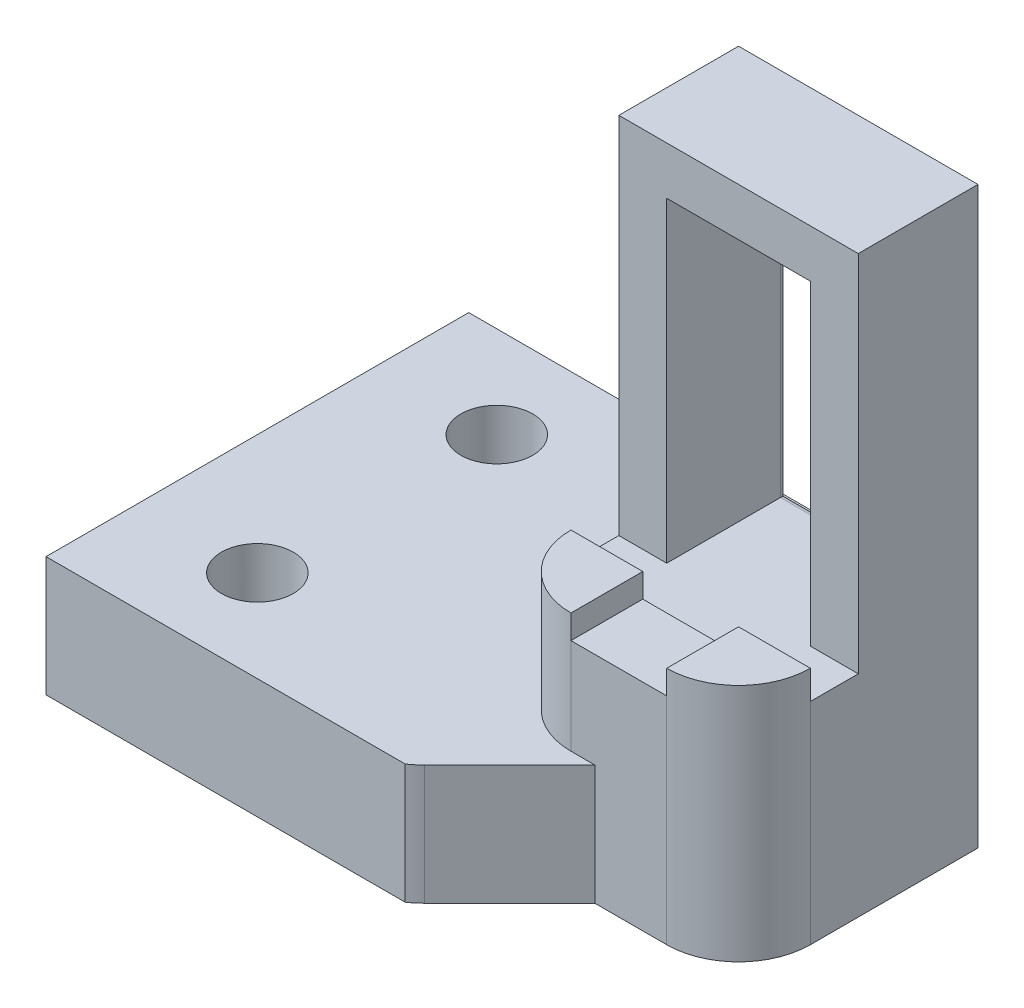
ISO-10303-21;
HEADER;
FILE_DESCRIPTION(('STEP AP214'),'2;1');
FILE_NAME('part.step','',(''),(''),'','','');
FILE_SCHEMA(('AUTOMOTIVE_DESIGN { 1 0 10303 214 1 1 1 1 }'));
ENDSEC;
DATA;
#1=APPLICATION_CONTEXT('core data for automotive mechanical design processes');
#2=APPLICATION_PROTOCOL_DEFINITION('international standard','automotive_design',2000,#1);
#3=PRODUCT_CONTEXT('',#1,'mechanical');
#4=PRODUCT('Part','Part','',(#3));
#5=PRODUCT_RELATED_PRODUCT_CATEGORY('part','',(#4));
#6=PRODUCT_DEFINITION_FORMATION('','',#4);
#7=PRODUCT_DEFINITION_CONTEXT('part definition',#1,'design');
#8=PRODUCT_DEFINITION('design','',#6,#7);
#9=PRODUCT_DEFINITION_SHAPE('','',#8);
#10=(LENGTH_UNIT() NAMED_UNIT(*) SI_UNIT(.MILLI.,.METRE.));
#11=(NAMED_UNIT(*) PLANE_ANGLE_UNIT() SI_UNIT($,.RADIAN.));
#12=(NAMED_UNIT(*) SI_UNIT($,.STERADIAN.) SOLID_ANGLE_UNIT());
#13=UNCERTAINTY_MEASURE_WITH_UNIT(LENGTH_MEASURE(1.E-05),#10,'distance_accuracy_value','');
#14=(GEOMETRIC_REPRESENTATION_CONTEXT(3) GLOBAL_UNCERTAINTY_ASSIGNED_CONTEXT((#13)) GLOBAL_UNIT_ASSIGNED_CONTEXT((#10,
#11,#12)) REPRESENTATION_CONTEXT('',''));
#15=CARTESIAN_POINT('',(0.,0.,0.));
#16=DIRECTION('',(0.,0.,1.));
#17=DIRECTION('',(1.,0.,0.));
#18=AXIS2_PLACEMENT_3D('',#15,#16,#17);
#19=CARTESIAN_POINT('',(0.,0.,0.));
#20=DIRECTION('',(0.,1.,0.));
#21=DIRECTION('',(0.,0.,1.));
#22=AXIS2_PLACEMENT_3D('',#19,#20,#21);
#23=PLANE('',#22);
#24=CARTESIAN_POINT('',(-30.,0.,-9.90312920037835));
#25=DIRECTION('',(0.,1.,0.));
#26=DIRECTION('',(0.,0.,1.));
#27=AXIS2_PLACEMENT_3D('',#24,#25,#26);
#28=CIRCLE('',#27,1.5);
#29=CARTESIAN_POINT('',(-30.,0.,-8.40312920037835));
#30=VERTEX_POINT('',#29);
#31=EDGE_CURVE('E422',#30,#30,#28,.T.);
#32=ORIENTED_EDGE('',*,*,#31,.T.);
#33=EDGE_LOOP('',(#32));
#34=FACE_BOUND('',#33,.T.);
#35=CARTESIAN_POINT('',(-30.,0.,0.0968707996216508));
#36=DIRECTION('',(0.,1.,0.));
#37=DIRECTION('',(0.,0.,1.));
#38=AXIS2_PLACEMENT_3D('',#35,#36,#37);
#39=CIRCLE('',#38,1.5);
#40=CARTESIAN_POINT('',(-30.,0.,1.59687079962165));
#41=VERTEX_POINT('',#40);
#42=EDGE_CURVE('E426',#41,#41,#39,.T.);
#43=ORIENTED_EDGE('',*,*,#42,.T.);
#44=EDGE_LOOP('',(#43));
#45=FACE_BOUND('',#44,.T.);
#46=DIRECTION('',(1.,0.,0.));
#47=VECTOR('',#46,1.);
#48=CARTESIAN_POINT('',(-45.,0.,-13.7305391633734));
#49=LINE('',#48,#47);
#50=CARTESIAN_POINT('',(-35.,0.,-13.7305391633734));
#51=VERTEX_POINT('',#50);
#52=CARTESIAN_POINT('',(-20.,0.,-13.7305391633734));
#53=VERTEX_POINT('',#52);
#54=EDGE_CURVE('E247',#51,#53,#49,.T.);
#55=ORIENTED_EDGE('',*,*,#54,.T.);
#56=DIRECTION('',(0.,0.,1.));
#57=VECTOR('',#56,1.);
#58=CARTESIAN_POINT('',(-20.,0.,0.));
#59=LINE('',#58,#57);
#60=CARTESIAN_POINT('',(-20.,0.,-9.99999999999999));
#61=VERTEX_POINT('',#60);
#62=EDGE_CURVE('E213',#53,#61,#59,.T.);
#63=ORIENTED_EDGE('',*,*,#62,.T.);
#64=DIRECTION('',(-1.,0.,0.));
#65=VECTOR('',#64,1.);
#66=CARTESIAN_POINT('',(0.,0.,-10.));
#67=LINE('',#66,#65);
#68=CARTESIAN_POINT('',(-10.,0.,-10.));
#69=VERTEX_POINT('',#68);
#70=EDGE_CURVE('E210',#69,#61,#67,.T.);
#71=ORIENTED_EDGE('',*,*,#70,.F.);
#72=DIRECTION('',(0.,0.,1.));
#73=VECTOR('',#72,1.);
#74=CARTESIAN_POINT('',(-10.,0.,0.));
#75=LINE('',#74,#73);
#76=CARTESIAN_POINT('',(-10.,0.,-2.99999999999999));
#77=VERTEX_POINT('',#76);
#78=EDGE_CURVE('E253',#69,#77,#75,.T.);
#79=ORIENTED_EDGE('',*,*,#78,.T.);
#80=CARTESIAN_POINT('',(-13.,0.,-3.));
#81=DIRECTION('',(0.,1.,0.));
#82=DIRECTION('',(0.,0.,1.));
#83=AXIS2_PLACEMENT_3D('',#80,#81,#82);
#84=CIRCLE('',#83,3.);
#85=CARTESIAN_POINT('',(-13.,0.,0.));
#86=VERTEX_POINT('',#85);
#87=EDGE_CURVE('E395',#77,#86,#84,.F.);
#88=ORIENTED_EDGE('',*,*,#87,.T.);
#89=DIRECTION('',(1.,0.,0.));
#90=VECTOR('',#89,1.);
#91=CARTESIAN_POINT('',(-30.,0.,0.));
#92=LINE('',#91,#90);
#93=CARTESIAN_POINT('',(-16.,0.,0.));
#94=VERTEX_POINT('',#93);
#95=EDGE_CURVE('E336',#94,#86,#92,.T.);
#96=ORIENTED_EDGE('',*,*,#95,.F.);
#97=DIRECTION('',(0.707106781186543,0.,-0.707106781186552));
#98=VECTOR('',#97,1.);
#99=CARTESIAN_POINT('',(-8.00000000000011,0.,-8.00000000000001));
#100=LINE('',#99,#98);
#101=CARTESIAN_POINT('',(-19.5631524016239,0.,3.56315240162395));
#102=VERTEX_POINT('',#101);
#103=EDGE_CURVE('E379',#94,#102,#100,.F.);
#104=ORIENTED_EDGE('',*,*,#103,.T.);
#105=CARTESIAN_POINT('',(-21.6844727451836,0.,1.44183205806432));
#106=DIRECTION('',(0.,1.,0.));
#107=DIRECTION('',(0.,0.,1.));
#108=AXIS2_PLACEMENT_3D('',#105,#106,#107);
#109=CIRCLE('',#108,3.);
#110=CARTESIAN_POINT('',(-20.,0.,3.92428076261668));
#111=VERTEX_POINT('',#110);
#112=EDGE_CURVE('E392',#102,#111,#109,.F.);
#113=ORIENTED_EDGE('',*,*,#112,.T.);
#114=DIRECTION('',(1.,0.,0.));
#115=VECTOR('',#114,1.);
#116=CARTESIAN_POINT('',(-45.,0.,3.92428076261668));
#117=LINE('',#116,#115);
#118=CARTESIAN_POINT('',(-35.,0.,3.92428076261668));
#119=VERTEX_POINT('',#118);
#120=EDGE_CURVE('E245',#119,#111,#117,.T.);
#121=ORIENTED_EDGE('',*,*,#120,.F.);
#122=DIRECTION('',(0.,0.,1.));
#123=VECTOR('',#122,1.);
#124=CARTESIAN_POINT('',(-35.,0.,-13.7305391633734));
#125=LINE('',#124,#123);
#126=EDGE_CURVE('E52',#51,#119,#125,.T.);
#127=ORIENTED_EDGE('',*,*,#126,.F.);
#128=EDGE_LOOP('',(#55,#63,#71,#79,#88,#96,#104,#113,#121,#127));
#129=FACE_BOUND('',#128,.T.);
#130=ADVANCED_FACE('F37',(#34,#45,#129),#23,.F.);
#131=CARTESIAN_POINT('',(0.,5.,0.));
#132=DIRECTION('',(0.,1.,0.));
#133=DIRECTION('',(0.,0.,1.));
#134=AXIS2_PLACEMENT_3D('',#131,#132,#133);
#135=PLANE('',#134);
#136=DIRECTION('',(0.,0.,1.));
#137=VECTOR('',#136,1.);
#138=CARTESIAN_POINT('',(-20.,5.,-9.99999999999999));
#139=LINE('',#138,#137);
#140=CARTESIAN_POINT('',(-20.,5.,-13.7305391633734));
#141=VERTEX_POINT('',#140);
#142=CARTESIAN_POINT('',(-20.,5.,-9.99999999999999));
#143=VERTEX_POINT('',#142);
#144=EDGE_CURVE('E214',#141,#143,#139,.T.);
#145=ORIENTED_EDGE('',*,*,#144,.F.);
#146=DIRECTION('',(1.,0.,0.));
#147=VECTOR('',#146,1.);
#148=CARTESIAN_POINT('',(-45.,5.,-13.7305391633734));
#149=LINE('',#148,#147);
#150=CARTESIAN_POINT('',(-35.,5.,-13.7305391633734));
#151=VERTEX_POINT('',#150);
#152=EDGE_CURVE('E236',#151,#141,#149,.T.);
#153=ORIENTED_EDGE('',*,*,#152,.F.);
#154=DIRECTION('',(0.,0.,-1.));
#155=VECTOR('',#154,1.);
#156=CARTESIAN_POINT('',(-35.,5.,3.92428076261668));
#157=LINE('',#156,#155);
#158=CARTESIAN_POINT('',(-35.,5.,3.92428076261668));
#159=VERTEX_POINT('',#158);
#160=EDGE_CURVE('E421',#159,#151,#157,.T.);
#161=ORIENTED_EDGE('',*,*,#160,.F.);
#162=DIRECTION('',(1.,0.,0.));
#163=VECTOR('',#162,1.);
#164=CARTESIAN_POINT('',(-45.,5.,3.92428076261668));
#165=LINE('',#164,#163);
#166=CARTESIAN_POINT('',(-20.,5.,3.92428076261668));
#167=VERTEX_POINT('',#166);
#168=EDGE_CURVE('E239',#159,#167,#165,.T.);
#169=ORIENTED_EDGE('',*,*,#168,.T.);
#170=CARTESIAN_POINT('',(-21.6844727451836,5.,1.44183205806432));
#171=DIRECTION('',(0.,1.,0.));
#172=DIRECTION('',(0.,0.,1.));
#173=AXIS2_PLACEMENT_3D('',#170,#171,#172);
#174=CIRCLE('',#173,3.);
#175=CARTESIAN_POINT('',(-19.5631524016239,5.,3.56315240162395));
#176=VERTEX_POINT('',#175);
#177=EDGE_CURVE('E60',#167,#176,#174,.T.);
#178=ORIENTED_EDGE('',*,*,#177,.T.);
#179=DIRECTION('',(-0.707106781186543,0.,0.707106781186552));
#180=VECTOR('',#179,1.);
#181=CARTESIAN_POINT('',(-20.,5.,4.00000000000003));
#182=LINE('',#181,#180);
#183=CARTESIAN_POINT('',(-16.,5.,0.));
#184=VERTEX_POINT('',#183);
#185=EDGE_CURVE('E377',#176,#184,#182,.F.);
#186=ORIENTED_EDGE('',*,*,#185,.T.);
#187=DIRECTION('',(1.,0.,0.));
#188=VECTOR('',#187,1.);
#189=CARTESIAN_POINT('',(-30.,5.,0.));
#190=LINE('',#189,#188);
#191=CARTESIAN_POINT('',(-17.,5.,0.));
#192=VERTEX_POINT('',#191);
#193=EDGE_CURVE('E374',#192,#184,#190,.T.);
#194=ORIENTED_EDGE('',*,*,#193,.F.);
#195=CARTESIAN_POINT('',(-17.,5.,-2.99999999999999));
#196=DIRECTION('',(0.,1.,0.));
#197=DIRECTION('',(0.,0.,1.));
#198=AXIS2_PLACEMENT_3D('',#195,#196,#197);
#199=CIRCLE('',#198,3.);
#200=CARTESIAN_POINT('',(-20.,5.,-2.99999999999999));
#201=VERTEX_POINT('',#200);
#202=EDGE_CURVE('E45',#192,#201,#199,.F.);
#203=ORIENTED_EDGE('',*,*,#202,.T.);
#204=DIRECTION('',(0.,0.,-1.));
#205=VECTOR('',#204,1.);
#206=CARTESIAN_POINT('',(-20.,5.,-13.7305391633734));
#207=LINE('',#206,#205);
#208=EDGE_CURVE('E224',#201,#143,#207,.T.);
#209=ORIENTED_EDGE('',*,*,#208,.T.);
#210=EDGE_LOOP('',(#145,#153,#161,#169,#178,#186,#194,#203,#209));
#211=FACE_BOUND('',#210,.T.);
#212=CARTESIAN_POINT('',(-30.,5.,-9.90312920037835));
#213=DIRECTION('',(0.,1.,0.));
#214=DIRECTION('',(0.,0.,1.));
#215=AXIS2_PLACEMENT_3D('',#212,#213,#214);
#216=CIRCLE('',#215,1.5);
#217=CARTESIAN_POINT('',(-30.,5.,-8.40312920037835));
#218=VERTEX_POINT('',#217);
#219=EDGE_CURVE('E431',#218,#218,#216,.T.);
#220=ORIENTED_EDGE('',*,*,#219,.F.);
#221=EDGE_LOOP('',(#220));
#222=FACE_BOUND('',#221,.T.);
#223=CARTESIAN_POINT('',(-30.,5.,0.0968707996216508));
#224=DIRECTION('',(0.,1.,0.));
#225=DIRECTION('',(0.,0.,-1.));
#226=AXIS2_PLACEMENT_3D('',#223,#224,#225);
#227=CIRCLE('',#226,1.5);
#228=CARTESIAN_POINT('',(-30.,5.,-1.40312920037835));
#229=VERTEX_POINT('',#228);
#230=EDGE_CURVE('E432',#229,#229,#227,.T.);
#231=ORIENTED_EDGE('',*,*,#230,.F.);
#232=EDGE_LOOP('',(#231));
#233=FACE_BOUND('',#232,.T.);
#234=ADVANCED_FACE('F231',(#211,#222,#233),#135,.T.);
#235=CARTESIAN_POINT('',(-45.,5.,-13.7305391633734));
#236=DIRECTION('',(0.,0.,1.));
#237=DIRECTION('',(1.,0.,0.));
#238=AXIS2_PLACEMENT_3D('',#235,#236,#237);
#239=PLANE('',#238);
#240=DIRECTION('',(0.,-1.,0.));
#241=VECTOR('',#240,1.);
#242=CARTESIAN_POINT('',(-35.,5.,-13.7305391633734));
#243=LINE('',#242,#241);
#244=EDGE_CURVE('E416',#151,#51,#243,.T.);
#245=ORIENTED_EDGE('',*,*,#244,.F.);
#246=ORIENTED_EDGE('',*,*,#152,.T.);
#247=DIRECTION('',(0.,1.,0.));
#248=VECTOR('',#247,1.);
#249=CARTESIAN_POINT('',(-20.,-5.,-13.7305391633734));
#250=LINE('',#249,#248);
#251=EDGE_CURVE('E11',#141,#53,#250,.F.);
#252=ORIENTED_EDGE('',*,*,#251,.T.);
#253=ORIENTED_EDGE('',*,*,#54,.F.);
#254=EDGE_LOOP('',(#245,#246,#252,#253));
#255=FACE_BOUND('',#254,.T.);
#256=ADVANCED_FACE('F419',(#255),#239,.F.);
#257=CARTESIAN_POINT('',(-45.,5.,3.92428076261668));
#258=DIRECTION('',(0.,0.,-1.));
#259=DIRECTION('',(-1.,0.,0.));
#260=AXIS2_PLACEMENT_3D('',#257,#258,#259);
#261=PLANE('',#260);
#262=DIRECTION('',(0.,1.,0.));
#263=VECTOR('',#262,1.);
#264=CARTESIAN_POINT('',(-35.,0.,3.92428076261668));
#265=LINE('',#264,#263);
#266=EDGE_CURVE('E237',#119,#159,#265,.T.);
#267=ORIENTED_EDGE('',*,*,#266,.F.);
#268=ORIENTED_EDGE('',*,*,#120,.T.);
#269=DIRECTION('',(0.,1.,0.));
#270=VECTOR('',#269,1.);
#271=CARTESIAN_POINT('',(-20.,-5.,3.92428076261668));
#272=LINE('',#271,#270);
#273=EDGE_CURVE('E250',#111,#167,#272,.T.);
#274=ORIENTED_EDGE('',*,*,#273,.T.);
#275=ORIENTED_EDGE('',*,*,#168,.F.);
#276=EDGE_LOOP('',(#267,#268,#274,#275));
#277=FACE_BOUND('',#276,.T.);
#278=ADVANCED_FACE('F414',(#277),#261,.F.);
#279=CARTESIAN_POINT('',(-20.,4.,0.));
#280=DIRECTION('',(1.,0.,0.));
#281=DIRECTION('',(0.,0.,-1.));
#282=AXIS2_PLACEMENT_3D('',#279,#280,#281);
#283=PLANE('',#282);
#284=ORIENTED_EDGE('',*,*,#208,.F.);
#285=DIRECTION('',(0.,-1.,0.));
#286=VECTOR('',#285,1.);
#287=CARTESIAN_POINT('',(-20.,4.,-2.99999999999999));
#288=LINE('',#287,#286);
#289=CARTESIAN_POINT('',(-20.,8.8,-3.));
#290=VERTEX_POINT('',#289);
#291=EDGE_CURVE('E386',#201,#290,#288,.F.);
#292=ORIENTED_EDGE('',*,*,#291,.T.);
#293=DIRECTION('',(0.,0.,1.));
#294=VECTOR('',#293,1.);
#295=CARTESIAN_POINT('',(-20.,8.8,-5.));
#296=LINE('',#295,#294);
#297=CARTESIAN_POINT('',(-20.,8.8,-5.));
#298=VERTEX_POINT('',#297);
#299=EDGE_CURVE('E294',#298,#290,#296,.T.);
#300=ORIENTED_EDGE('',*,*,#299,.F.);
#301=DIRECTION('',(0.,1.,0.));
#302=VECTOR('',#301,1.);
#303=CARTESIAN_POINT('',(-20.,-7.18033988749895,-5.));
#304=LINE('',#303,#302);
#305=CARTESIAN_POINT('',(-20.,24.,-5.));
#306=VERTEX_POINT('',#305);
#307=EDGE_CURVE('E306',#298,#306,#304,.T.);
#308=ORIENTED_EDGE('',*,*,#307,.T.);
#309=DIRECTION('',(0.,0.,1.));
#310=VECTOR('',#309,1.);
#311=CARTESIAN_POINT('',(-20.,24.,5.00000000000001));
#312=LINE('',#311,#310);
#313=CARTESIAN_POINT('',(-20.,24.,-10.));
#314=VERTEX_POINT('',#313);
#315=EDGE_CURVE('E227',#314,#306,#312,.T.);
#316=ORIENTED_EDGE('',*,*,#315,.F.);
#317=DIRECTION('',(0.,-1.,0.));
#318=VECTOR('',#317,1.);
#319=CARTESIAN_POINT('',(-20.,24.,-10.));
#320=LINE('',#319,#318);
#321=EDGE_CURVE('E207',#314,#143,#320,.T.);
#322=ORIENTED_EDGE('',*,*,#321,.T.);
#323=EDGE_LOOP('',(#284,#292,#300,#308,#316,#322));
#324=FACE_BOUND('',#323,.T.);
#325=ADVANCED_FACE('F223',(#324),#283,.F.);
#326=CARTESIAN_POINT('',(-30.,4.,0.));
#327=DIRECTION('',(0.,0.,-1.));
#328=DIRECTION('',(-1.,0.,0.));
#329=AXIS2_PLACEMENT_3D('',#326,#327,#328);
#330=PLANE('',#329);
#331=DIRECTION('',(1.,0.,0.));
#332=VECTOR('',#331,1.);
#333=CARTESIAN_POINT('',(-17.,9.,0.));
#334=LINE('',#333,#332);
#335=CARTESIAN_POINT('',(-17.,9.,0.));
#336=VERTEX_POINT('',#335);
#337=CARTESIAN_POINT('',(-13.,9.,0.));
#338=VERTEX_POINT('',#337);
#339=EDGE_CURVE('E284',#336,#338,#334,.T.);
#340=ORIENTED_EDGE('',*,*,#339,.F.);
#341=DIRECTION('',(0.,-1.,0.));
#342=VECTOR('',#341,1.);
#343=CARTESIAN_POINT('',(-17.,4.,0.));
#344=LINE('',#343,#342);
#345=EDGE_CURVE('E384',#336,#192,#344,.T.);
#346=ORIENTED_EDGE('',*,*,#345,.T.);
#347=ORIENTED_EDGE('',*,*,#193,.T.);
#348=DIRECTION('',(0.,-1.,0.));
#349=VECTOR('',#348,1.);
#350=CARTESIAN_POINT('',(-16.,0.,0.));
#351=LINE('',#350,#349);
#352=EDGE_CURVE('E372',#184,#94,#351,.T.);
#353=ORIENTED_EDGE('',*,*,#352,.T.);
#354=ORIENTED_EDGE('',*,*,#95,.T.);
#355=DIRECTION('',(0.,-1.,0.));
#356=VECTOR('',#355,1.);
#357=CARTESIAN_POINT('',(-13.,4.,0.));
#358=LINE('',#357,#356);
#359=EDGE_CURVE('E382',#86,#338,#358,.F.);
#360=ORIENTED_EDGE('',*,*,#359,.T.);
#361=EDGE_LOOP('',(#340,#346,#347,#353,#354,#360));
#362=FACE_BOUND('',#361,.T.);
#363=ADVANCED_FACE('F450',(#362),#330,.F.);
#364=CARTESIAN_POINT('',(0.,4.,-10.));
#365=DIRECTION('',(0.,0.,1.));
#366=DIRECTION('',(1.,0.,0.));
#367=AXIS2_PLACEMENT_3D('',#364,#365,#366);
#368=PLANE('',#367);
#369=DIRECTION('',(0.,1.,0.));
#370=VECTOR('',#369,1.);
#371=CARTESIAN_POINT('',(-20.,-9.,-9.99999999999999));
#372=LINE('',#371,#370);
#373=EDGE_CURVE('E201',#61,#143,#372,.T.);
#374=ORIENTED_EDGE('',*,*,#373,.T.);
#375=ORIENTED_EDGE('',*,*,#321,.F.);
#376=DIRECTION('',(-1.,0.,0.));
#377=VECTOR('',#376,1.);
#378=CARTESIAN_POINT('',(-20.,24.,-10.));
#379=LINE('',#378,#377);
#380=CARTESIAN_POINT('',(-10.,24.,-10.));
#381=VERTEX_POINT('',#380);
#382=EDGE_CURVE('E229',#381,#314,#379,.T.);
#383=ORIENTED_EDGE('',*,*,#382,.F.);
#384=DIRECTION('',(0.,-1.,0.));
#385=VECTOR('',#384,1.);
#386=CARTESIAN_POINT('',(-10.,24.,-10.));
#387=LINE('',#386,#385);
#388=EDGE_CURVE('E228',#381,#69,#387,.T.);
#389=ORIENTED_EDGE('',*,*,#388,.T.);
#390=ORIENTED_EDGE('',*,*,#70,.T.);
#391=EDGE_LOOP('',(#374,#375,#383,#389,#390));
#392=FACE_BOUND('',#391,.T.);
#393=DIRECTION('',(1.,0.,0.));
#394=VECTOR('',#393,1.);
#395=CARTESIAN_POINT('',(0.,22.25,-10.));
#396=LINE('',#395,#394);
#397=CARTESIAN_POINT('',(-11.75,22.25,-10.));
#398=VERTEX_POINT('',#397);
#399=CARTESIAN_POINT('',(-18.25,22.25,-10.));
#400=VERTEX_POINT('',#399);
#401=EDGE_CURVE('E346',#398,#400,#396,.F.);
#402=ORIENTED_EDGE('',*,*,#401,.T.);
#403=DIRECTION('',(0.,1.,0.));
#404=VECTOR('',#403,1.);
#405=CARTESIAN_POINT('',(-18.25,4.,-10.));
#406=LINE('',#405,#404);
#407=CARTESIAN_POINT('',(-18.25,8.55,-10.));
#408=VERTEX_POINT('',#407);
#409=EDGE_CURVE('E351',#400,#408,#406,.F.);
#410=ORIENTED_EDGE('',*,*,#409,.T.);
#411=DIRECTION('',(-1.,0.,0.));
#412=VECTOR('',#411,1.);
#413=CARTESIAN_POINT('',(0.,8.55,-10.));
#414=LINE('',#413,#412);
#415=CARTESIAN_POINT('',(-11.75,8.55,-10.));
#416=VERTEX_POINT('',#415);
#417=EDGE_CURVE('E348',#408,#416,#414,.F.);
#418=ORIENTED_EDGE('',*,*,#417,.T.);
#419=DIRECTION('',(0.,-1.,0.));
#420=VECTOR('',#419,1.);
#421=CARTESIAN_POINT('',(-11.75,4.,-10.));
#422=LINE('',#421,#420);
#423=EDGE_CURVE('E344',#416,#398,#422,.F.);
#424=ORIENTED_EDGE('',*,*,#423,.T.);
#425=EDGE_LOOP('',(#402,#410,#418,#424));
#426=FACE_BOUND('',#425,.T.);
#427=ADVANCED_FACE('F203',(#392,#426),#368,.F.);
#428=CARTESIAN_POINT('',(-12.,8.8,-0.5));
#429=DIRECTION('',(0.,-1.,0.));
#430=DIRECTION('',(1.,0.,0.));
#431=AXIS2_PLACEMENT_3D('',#428,#429,#430);
#432=PLANE('',#431);
#433=DIRECTION('',(-1.,0.,0.));
#434=VECTOR('',#433,1.);
#435=CARTESIAN_POINT('',(-10.,8.8,-3.));
#436=LINE('',#435,#434);
#437=CARTESIAN_POINT('',(-10.,8.8,-3.));
#438=VERTEX_POINT('',#437);
#439=EDGE_CURVE('E271',#438,#290,#436,.T.);
#440=ORIENTED_EDGE('',*,*,#439,.F.);
#441=DIRECTION('',(0.,0.,-1.));
#442=VECTOR('',#441,1.);
#443=CARTESIAN_POINT('',(-10.,8.8,-5.));
#444=LINE('',#443,#442);
#445=CARTESIAN_POINT('',(-10.,8.8,-5.));
#446=VERTEX_POINT('',#445);
#447=EDGE_CURVE('E297',#438,#446,#444,.T.);
#448=ORIENTED_EDGE('',*,*,#447,.T.);
#449=DIRECTION('',(-1.,0.,0.));
#450=VECTOR('',#449,1.);
#451=CARTESIAN_POINT('',(-20.,8.8,-5.));
#452=LINE('',#451,#450);
#453=CARTESIAN_POINT('',(-12.,8.8,-5.));
#454=VERTEX_POINT('',#453);
#455=EDGE_CURVE('E300',#446,#454,#452,.T.);
#456=ORIENTED_EDGE('',*,*,#455,.T.);
#457=DIRECTION('',(0.,0.,-1.));
#458=VECTOR('',#457,1.);
#459=CARTESIAN_POINT('',(-12.,8.8,-0.5));
#460=LINE('',#459,#458);
#461=CARTESIAN_POINT('',(-12.,8.8,-9.75));
#462=VERTEX_POINT('',#461);
#463=EDGE_CURVE('E318',#454,#462,#460,.T.);
#464=ORIENTED_EDGE('',*,*,#463,.T.);
#465=DIRECTION('',(-1.,0.,0.));
#466=VECTOR('',#465,1.);
#467=CARTESIAN_POINT('',(-12.,8.8,-9.75));
#468=LINE('',#467,#466);
#469=CARTESIAN_POINT('',(-18.,8.8,-9.75));
#470=VERTEX_POINT('',#469);
#471=EDGE_CURVE('E341',#462,#470,#468,.T.);
#472=ORIENTED_EDGE('',*,*,#471,.T.);
#473=DIRECTION('',(0.,0.,-1.));
#474=VECTOR('',#473,1.);
#475=CARTESIAN_POINT('',(-18.,8.8,-0.5));
#476=LINE('',#475,#474);
#477=CARTESIAN_POINT('',(-18.,8.8,-5.));
#478=VERTEX_POINT('',#477);
#479=EDGE_CURVE('E325',#478,#470,#476,.T.);
#480=ORIENTED_EDGE('',*,*,#479,.F.);
#481=DIRECTION('',(1.,0.,0.));
#482=VECTOR('',#481,1.);
#483=CARTESIAN_POINT('',(-20.,8.8,-5.));
#484=LINE('',#483,#482);
#485=EDGE_CURVE('E339',#298,#478,#484,.T.);
#486=ORIENTED_EDGE('',*,*,#485,.F.);
#487=ORIENTED_EDGE('',*,*,#299,.T.);
#488=EDGE_LOOP('',(#440,#448,#456,#464,#472,#480,#486,#487));
#489=FACE_BOUND('',#488,.T.);
#490=ADVANCED_FACE('F469',(#489),#432,.F.);
#491=CARTESIAN_POINT('',(0.,10.,0.));
#492=DIRECTION('',(0.,1.,0.));
#493=DIRECTION('',(0.,0.,1.));
#494=AXIS2_PLACEMENT_3D('',#491,#492,#493);
#495=PLANE('',#494);
#496=DIRECTION('',(0.,0.,-1.));
#497=VECTOR('',#496,1.);
#498=CARTESIAN_POINT('',(-13.,10.,0.));
#499=LINE('',#498,#497);
#500=CARTESIAN_POINT('',(-13.,10.,0.));
#501=VERTEX_POINT('',#500);
#502=CARTESIAN_POINT('',(-13.,10.,-3.));
#503=VERTEX_POINT('',#502);
#504=EDGE_CURVE('E370',#501,#503,#499,.T.);
#505=ORIENTED_EDGE('',*,*,#504,.F.);
#506=CARTESIAN_POINT('',(-13.,10.,-3.));
#507=DIRECTION('',(0.,1.,0.));
#508=DIRECTION('',(0.,0.,1.));
#509=AXIS2_PLACEMENT_3D('',#506,#507,#508);
#510=CIRCLE('',#509,3.);
#511=CARTESIAN_POINT('',(-10.,10.,-3.));
#512=VERTEX_POINT('',#511);
#513=EDGE_CURVE('E397',#501,#512,#510,.T.);
#514=ORIENTED_EDGE('',*,*,#513,.T.);
#515=DIRECTION('',(1.,0.,0.));
#516=VECTOR('',#515,1.);
#517=CARTESIAN_POINT('',(-13.,10.,-3.));
#518=LINE('',#517,#516);
#519=EDGE_CURVE('E265',#503,#512,#518,.T.);
#520=ORIENTED_EDGE('',*,*,#519,.F.);
#521=EDGE_LOOP('',(#505,#514,#520));
#522=FACE_BOUND('',#521,.T.);
#523=ADVANCED_FACE('F477',(#522),#495,.T.);
#524=CARTESIAN_POINT('',(-10.,4.,5.00000000000001));
#525=DIRECTION('',(-1.,0.,0.));
#526=DIRECTION('',(0.,0.,1.));
#527=AXIS2_PLACEMENT_3D('',#524,#525,#526);
#528=PLANE('',#527);
#529=ORIENTED_EDGE('',*,*,#447,.F.);
#530=DIRECTION('',(0.,-1.,0.));
#531=VECTOR('',#530,1.);
#532=CARTESIAN_POINT('',(-10.,4.,-2.99999999999999));
#533=LINE('',#532,#531);
#534=EDGE_CURVE('E390',#438,#77,#533,.T.);
#535=ORIENTED_EDGE('',*,*,#534,.T.);
#536=ORIENTED_EDGE('',*,*,#78,.F.);
#537=ORIENTED_EDGE('',*,*,#388,.F.);
#538=DIRECTION('',(0.,0.,-1.));
#539=VECTOR('',#538,1.);
#540=CARTESIAN_POINT('',(-10.,24.,5.00000000000001));
#541=LINE('',#540,#539);
#542=CARTESIAN_POINT('',(-10.,24.,-5.));
#543=VERTEX_POINT('',#542);
#544=EDGE_CURVE('E331',#543,#381,#541,.T.);
#545=ORIENTED_EDGE('',*,*,#544,.F.);
#546=DIRECTION('',(0.,1.,0.));
#547=VECTOR('',#546,1.);
#548=CARTESIAN_POINT('',(-10.,-7.18033988749895,-5.));
#549=LINE('',#548,#547);
#550=EDGE_CURVE('E305',#446,#543,#549,.T.);
#551=ORIENTED_EDGE('',*,*,#550,.F.);
#552=EDGE_LOOP('',(#529,#535,#536,#537,#545,#551));
#553=FACE_BOUND('',#552,.T.);
#554=ADVANCED_FACE('F496',(#553),#528,.F.);
#555=CARTESIAN_POINT('',(0.,24.,0.));
#556=DIRECTION('',(0.,-1.,0.));
#557=DIRECTION('',(0.,0.,-1.));
#558=AXIS2_PLACEMENT_3D('',#555,#556,#557);
#559=PLANE('',#558);
#560=ORIENTED_EDGE('',*,*,#315,.T.);
#561=DIRECTION('',(-1.,0.,0.));
#562=VECTOR('',#561,1.);
#563=CARTESIAN_POINT('',(-20.,24.,-5.));
#564=LINE('',#563,#562);
#565=EDGE_CURVE('E302',#543,#306,#564,.T.);
#566=ORIENTED_EDGE('',*,*,#565,.F.);
#567=ORIENTED_EDGE('',*,*,#544,.T.);
#568=ORIENTED_EDGE('',*,*,#382,.T.);
#569=EDGE_LOOP('',(#560,#566,#567,#568));
#570=FACE_BOUND('',#569,.T.);
#571=ADVANCED_FACE('F508',(#570),#559,.F.);
#572=CARTESIAN_POINT('',(-12.,22.,-0.5));
#573=DIRECTION('',(1.,0.,0.));
#574=DIRECTION('',(0.,1.,0.));
#575=AXIS2_PLACEMENT_3D('',#572,#573,#574);
#576=PLANE('',#575);
#577=DIRECTION('',(0.,0.,-1.));
#578=VECTOR('',#577,1.);
#579=CARTESIAN_POINT('',(-12.,22.,-0.5));
#580=LINE('',#579,#578);
#581=CARTESIAN_POINT('',(-12.,22.,-5.));
#582=VERTEX_POINT('',#581);
#583=CARTESIAN_POINT('',(-12.,22.,-9.75));
#584=VERTEX_POINT('',#583);
#585=EDGE_CURVE('E319',#582,#584,#580,.T.);
#586=ORIENTED_EDGE('',*,*,#585,.T.);
#587=DIRECTION('',(0.,-1.,0.));
#588=VECTOR('',#587,1.);
#589=CARTESIAN_POINT('',(-12.,22.,-9.75));
#590=LINE('',#589,#588);
#591=EDGE_CURVE('E357',#584,#462,#590,.T.);
#592=ORIENTED_EDGE('',*,*,#591,.T.);
#593=ORIENTED_EDGE('',*,*,#463,.F.);
#594=DIRECTION('',(0.,1.,0.));
#595=VECTOR('',#594,1.);
#596=CARTESIAN_POINT('',(-12.,22.,-5.));
#597=LINE('',#596,#595);
#598=EDGE_CURVE('E315',#454,#582,#597,.T.);
#599=ORIENTED_EDGE('',*,*,#598,.T.);
#600=EDGE_LOOP('',(#586,#592,#593,#599));
#601=FACE_BOUND('',#600,.T.);
#602=ADVANCED_FACE('F842',(#601),#576,.F.);
#603=CARTESIAN_POINT('',(-12.,22.,-0.5));
#604=DIRECTION('',(0.,1.,0.));
#605=DIRECTION('',(0.,0.,1.));
#606=AXIS2_PLACEMENT_3D('',#603,#604,#605);
#607=PLANE('',#606);
#608=DIRECTION('',(0.,0.,-1.));
#609=VECTOR('',#608,1.);
#610=CARTESIAN_POINT('',(-18.,22.,-0.5));
#611=LINE('',#610,#609);
#612=CARTESIAN_POINT('',(-18.,22.,-5.));
#613=VERTEX_POINT('',#612);
#614=CARTESIAN_POINT('',(-18.,22.,-9.75));
#615=VERTEX_POINT('',#614);
#616=EDGE_CURVE('E322',#613,#615,#611,.T.);
#617=ORIENTED_EDGE('',*,*,#616,.T.);
#618=DIRECTION('',(1.,0.,0.));
#619=VECTOR('',#618,1.);
#620=CARTESIAN_POINT('',(-12.,22.,-9.75));
#621=LINE('',#620,#619);
#622=EDGE_CURVE('E353',#615,#584,#621,.T.);
#623=ORIENTED_EDGE('',*,*,#622,.T.);
#624=ORIENTED_EDGE('',*,*,#585,.F.);
#625=DIRECTION('',(-1.,0.,0.));
#626=VECTOR('',#625,1.);
#627=CARTESIAN_POINT('',(-12.,22.,-5.));
#628=LINE('',#627,#626);
#629=EDGE_CURVE('E312',#582,#613,#628,.T.);
#630=ORIENTED_EDGE('',*,*,#629,.T.);
#631=EDGE_LOOP('',(#617,#623,#624,#630));
#632=FACE_BOUND('',#631,.T.);
#633=ADVANCED_FACE('F833',(#632),#607,.F.);
#634=CARTESIAN_POINT('',(-18.,22.,-0.5));
#635=DIRECTION('',(-1.,0.,0.));
#636=DIRECTION('',(0.,0.,1.));
#637=AXIS2_PLACEMENT_3D('',#634,#635,#636);
#638=PLANE('',#637);
#639=ORIENTED_EDGE('',*,*,#479,.T.);
#640=DIRECTION('',(0.,1.,0.));
#641=VECTOR('',#640,1.);
#642=CARTESIAN_POINT('',(-18.,22.,-9.75));
#643=LINE('',#642,#641);
#644=EDGE_CURVE('E355',#470,#615,#643,.T.);
#645=ORIENTED_EDGE('',*,*,#644,.T.);
#646=ORIENTED_EDGE('',*,*,#616,.F.);
#647=DIRECTION('',(0.,-1.,0.));
#648=VECTOR('',#647,1.);
#649=CARTESIAN_POINT('',(-18.,22.,-5.));
#650=LINE('',#649,#648);
#651=EDGE_CURVE('E308',#613,#478,#650,.T.);
#652=ORIENTED_EDGE('',*,*,#651,.T.);
#653=EDGE_LOOP('',(#639,#645,#646,#652));
#654=FACE_BOUND('',#653,.T.);
#655=ADVANCED_FACE('F491',(#654),#638,.F.);
#656=CARTESIAN_POINT('',(-20.,-7.18033988749895,-5.));
#657=DIRECTION('',(0.,0.,-1.));
#658=DIRECTION('',(-1.,0.,0.));
#659=AXIS2_PLACEMENT_3D('',#656,#657,#658);
#660=PLANE('',#659);
#661=ORIENTED_EDGE('',*,*,#307,.F.);
#662=ORIENTED_EDGE('',*,*,#485,.T.);
#663=ORIENTED_EDGE('',*,*,#651,.F.);
#664=ORIENTED_EDGE('',*,*,#629,.F.);
#665=ORIENTED_EDGE('',*,*,#598,.F.);
#666=ORIENTED_EDGE('',*,*,#455,.F.);
#667=ORIENTED_EDGE('',*,*,#550,.T.);
#668=ORIENTED_EDGE('',*,*,#565,.T.);
#669=EDGE_LOOP('',(#661,#662,#663,#664,#665,#666,#667,#668));
#670=FACE_BOUND('',#669,.T.);
#671=ADVANCED_FACE('F482',(#670),#660,.F.);
#672=DIRECTION('',(1.,0.,0.));
#673=VECTOR('',#672,1.);
#674=CARTESIAN_POINT('',(-20.,10.,-3.));
#675=LINE('',#674,#673);
#676=CARTESIAN_POINT('',(-20.,10.,-3.));
#677=VERTEX_POINT('',#676);
#678=CARTESIAN_POINT('',(-17.,10.,-3.));
#679=VERTEX_POINT('',#678);
#680=EDGE_CURVE('E276',#677,#679,#675,.T.);
#681=ORIENTED_EDGE('',*,*,#680,.F.);
#682=CARTESIAN_POINT('',(-17.,10.,-2.99999999999999));
#683=DIRECTION('',(0.,1.,0.));
#684=DIRECTION('',(0.,0.,1.));
#685=AXIS2_PLACEMENT_3D('',#682,#683,#684);
#686=CIRCLE('',#685,3.);
#687=CARTESIAN_POINT('',(-17.,10.,0.));
#688=VERTEX_POINT('',#687);
#689=EDGE_CURVE('E388',#677,#688,#686,.T.);
#690=ORIENTED_EDGE('',*,*,#689,.T.);
#691=DIRECTION('',(0.,0.,1.));
#692=VECTOR('',#691,1.);
#693=CARTESIAN_POINT('',(-17.,10.,0.));
#694=LINE('',#693,#692);
#695=EDGE_CURVE('E359',#679,#688,#694,.T.);
#696=ORIENTED_EDGE('',*,*,#695,.F.);
#697=EDGE_LOOP('',(#681,#690,#696));
#698=FACE_BOUND('',#697,.T.);
#699=ADVANCED_FACE('F479',(#698),#495,.T.);
#700=CARTESIAN_POINT('',(-12.,22.25,-9.75));
#701=DIRECTION('',(1.,0.,0.));
#702=DIRECTION('',(0.,0.,-1.));
#703=AXIS2_PLACEMENT_3D('',#700,#701,#702);
#704=CYLINDRICAL_SURFACE('',#703,0.25);
#705=CARTESIAN_POINT('',(-18.25,22.25,-9.75));
#706=DIRECTION('',(0.707106781186547,0.707106781186547,0.));
#707=DIRECTION('',(0.707106781186547,-0.707106781186547,0.));
#708=AXIS2_PLACEMENT_3D('',#705,#706,#707);
#709=ELLIPSE('',#708,0.353553390593274,0.25);
#710=EDGE_CURVE('E363',#400,#615,#709,.F.);
#711=ORIENTED_EDGE('',*,*,#710,.F.);
#712=ORIENTED_EDGE('',*,*,#401,.F.);
#713=CARTESIAN_POINT('',(-11.75,22.25,-9.75));
#714=DIRECTION('',(0.707106781186547,-0.707106781186548,0.));
#715=DIRECTION('',(0.707106781186548,0.707106781186547,0.));
#716=AXIS2_PLACEMENT_3D('',#713,#714,#715);
#717=ELLIPSE('',#716,0.353553390593274,0.25);
#718=EDGE_CURVE('E298',#584,#398,#717,.T.);
#719=ORIENTED_EDGE('',*,*,#718,.F.);
#720=ORIENTED_EDGE('',*,*,#622,.F.);
#721=EDGE_LOOP('',(#711,#712,#719,#720));
#722=FACE_BOUND('',#721,.T.);
#723=ADVANCED_FACE('F481',(#722),#704,.T.);
#724=CARTESIAN_POINT('',(-11.75,22.,-9.75));
#725=DIRECTION('',(0.,-1.,0.));
#726=DIRECTION('',(1.,0.,0.));
#727=AXIS2_PLACEMENT_3D('',#724,#725,#726);
#728=CYLINDRICAL_SURFACE('',#727,0.25);
#729=ORIENTED_EDGE('',*,*,#718,.T.);
#730=ORIENTED_EDGE('',*,*,#423,.F.);
#731=CARTESIAN_POINT('',(-11.75,8.55,-9.75));
#732=DIRECTION('',(-0.707106781186547,-0.707106781186547,0.));
#733=DIRECTION('',(-0.707106781186548,0.707106781186547,0.));
#734=AXIS2_PLACEMENT_3D('',#731,#732,#733);
#735=ELLIPSE('',#734,0.353553390593274,0.25);
#736=EDGE_CURVE('E361',#462,#416,#735,.T.);
#737=ORIENTED_EDGE('',*,*,#736,.F.);
#738=ORIENTED_EDGE('',*,*,#591,.F.);
#739=EDGE_LOOP('',(#729,#730,#737,#738));
#740=FACE_BOUND('',#739,.T.);
#741=ADVANCED_FACE('F488',(#740),#728,.T.);
#742=CARTESIAN_POINT('',(-18.25,22.,-9.75));
#743=DIRECTION('',(0.,1.,0.));
#744=DIRECTION('',(0.,0.,1.));
#745=AXIS2_PLACEMENT_3D('',#742,#743,#744);
#746=CYLINDRICAL_SURFACE('',#745,0.25);
#747=ORIENTED_EDGE('',*,*,#710,.T.);
#748=ORIENTED_EDGE('',*,*,#644,.F.);
#749=CARTESIAN_POINT('',(-18.25,8.55,-9.75));
#750=DIRECTION('',(-0.707106781186548,0.707106781186547,0.));
#751=DIRECTION('',(-0.707106781186547,-0.707106781186548,0.));
#752=AXIS2_PLACEMENT_3D('',#749,#750,#751);
#753=ELLIPSE('',#752,0.353553390593274,0.25);
#754=EDGE_CURVE('E291',#408,#470,#753,.F.);
#755=ORIENTED_EDGE('',*,*,#754,.F.);
#756=ORIENTED_EDGE('',*,*,#409,.F.);
#757=EDGE_LOOP('',(#747,#748,#755,#756));
#758=FACE_BOUND('',#757,.T.);
#759=ADVANCED_FACE('F521',(#758),#746,.T.);
#760=CARTESIAN_POINT('',(-12.,8.55,-9.75));
#761=DIRECTION('',(-1.,0.,0.));
#762=DIRECTION('',(0.,-1.,0.));
#763=AXIS2_PLACEMENT_3D('',#760,#761,#762);
#764=CYLINDRICAL_SURFACE('',#763,0.25);
#765=ORIENTED_EDGE('',*,*,#736,.T.);
#766=ORIENTED_EDGE('',*,*,#417,.F.);
#767=ORIENTED_EDGE('',*,*,#754,.T.);
#768=ORIENTED_EDGE('',*,*,#471,.F.);
#769=EDGE_LOOP('',(#765,#766,#767,#768));
#770=FACE_BOUND('',#769,.T.);
#771=ADVANCED_FACE('F518',(#770),#764,.T.);
#772=CARTESIAN_POINT('',(-17.,9.,-5.2));
#773=DIRECTION('',(0.,-1.,0.));
#774=DIRECTION('',(0.,0.,-1.));
#775=AXIS2_PLACEMENT_3D('',#772,#773,#774);
#776=PLANE('',#775);
#777=DIRECTION('',(0.,0.,1.));
#778=VECTOR('',#777,1.);
#779=CARTESIAN_POINT('',(-17.,9.,-5.2));
#780=LINE('',#779,#778);
#781=CARTESIAN_POINT('',(-17.,9.,-3.));
#782=VERTEX_POINT('',#781);
#783=EDGE_CURVE('E287',#782,#336,#780,.T.);
#784=ORIENTED_EDGE('',*,*,#783,.T.);
#785=ORIENTED_EDGE('',*,*,#339,.T.);
#786=DIRECTION('',(0.,0.,1.));
#787=VECTOR('',#786,1.);
#788=CARTESIAN_POINT('',(-13.,9.,-5.2));
#789=LINE('',#788,#787);
#790=CARTESIAN_POINT('',(-13.,9.,-3.));
#791=VERTEX_POINT('',#790);
#792=EDGE_CURVE('E288',#791,#338,#789,.T.);
#793=ORIENTED_EDGE('',*,*,#792,.F.);
#794=DIRECTION('',(1.,0.,0.));
#795=VECTOR('',#794,1.);
#796=CARTESIAN_POINT('',(-17.,9.,-3.));
#797=LINE('',#796,#795);
#798=EDGE_CURVE('E259',#782,#791,#797,.T.);
#799=ORIENTED_EDGE('',*,*,#798,.F.);
#800=EDGE_LOOP('',(#784,#785,#793,#799));
#801=FACE_BOUND('',#800,.T.);
#802=ADVANCED_FACE('F457',(#801),#776,.F.);
#803=CARTESIAN_POINT('',(-13.,10.,-5.2));
#804=DIRECTION('',(1.,0.,0.));
#805=DIRECTION('',(0.,0.,-1.));
#806=AXIS2_PLACEMENT_3D('',#803,#804,#805);
#807=PLANE('',#806);
#808=ORIENTED_EDGE('',*,*,#792,.T.);
#809=DIRECTION('',(0.,1.,0.));
#810=VECTOR('',#809,1.);
#811=CARTESIAN_POINT('',(-13.,10.,0.));
#812=LINE('',#811,#810);
#813=EDGE_CURVE('E279',#338,#501,#812,.T.);
#814=ORIENTED_EDGE('',*,*,#813,.T.);
#815=ORIENTED_EDGE('',*,*,#504,.T.);
#816=DIRECTION('',(0.,1.,0.));
#817=VECTOR('',#816,1.);
#818=CARTESIAN_POINT('',(-13.,9.,-3.));
#819=LINE('',#818,#817);
#820=EDGE_CURVE('E262',#791,#503,#819,.T.);
#821=ORIENTED_EDGE('',*,*,#820,.F.);
#822=EDGE_LOOP('',(#808,#814,#815,#821));
#823=FACE_BOUND('',#822,.T.);
#824=ADVANCED_FACE('F453',(#823),#807,.F.);
#825=CARTESIAN_POINT('',(-17.,10.,-5.2));
#826=DIRECTION('',(-1.,0.,0.));
#827=DIRECTION('',(0.,0.,1.));
#828=AXIS2_PLACEMENT_3D('',#825,#826,#827);
#829=PLANE('',#828);
#830=ORIENTED_EDGE('',*,*,#695,.T.);
#831=DIRECTION('',(0.,-1.,0.));
#832=VECTOR('',#831,1.);
#833=CARTESIAN_POINT('',(-17.,10.,0.));
#834=LINE('',#833,#832);
#835=EDGE_CURVE('E281',#688,#336,#834,.T.);
#836=ORIENTED_EDGE('',*,*,#835,.T.);
#837=ORIENTED_EDGE('',*,*,#783,.F.);
#838=DIRECTION('',(0.,-1.,0.));
#839=VECTOR('',#838,1.);
#840=CARTESIAN_POINT('',(-17.,10.,-3.));
#841=LINE('',#840,#839);
#842=EDGE_CURVE('E256',#679,#782,#841,.T.);
#843=ORIENTED_EDGE('',*,*,#842,.F.);
#844=EDGE_LOOP('',(#830,#836,#837,#843));
#845=FACE_BOUND('',#844,.T.);
#846=ADVANCED_FACE('F461',(#845),#829,.F.);
#847=CARTESIAN_POINT('',(0.,0.,-3.));
#848=DIRECTION('',(0.,0.,1.));
#849=DIRECTION('',(1.,0.,0.));
#850=AXIS2_PLACEMENT_3D('',#847,#848,#849);
#851=PLANE('',#850);
#852=ORIENTED_EDGE('',*,*,#842,.T.);
#853=ORIENTED_EDGE('',*,*,#798,.T.);
#854=ORIENTED_EDGE('',*,*,#820,.T.);
#855=ORIENTED_EDGE('',*,*,#519,.T.);
#856=DIRECTION('',(0.,-1.,0.));
#857=VECTOR('',#856,1.);
#858=CARTESIAN_POINT('',(-10.,10.,-3.));
#859=LINE('',#858,#857);
#860=EDGE_CURVE('E268',#512,#438,#859,.T.);
#861=ORIENTED_EDGE('',*,*,#860,.T.);
#862=ORIENTED_EDGE('',*,*,#439,.T.);
#863=DIRECTION('',(0.,1.,0.));
#864=VECTOR('',#863,1.);
#865=CARTESIAN_POINT('',(-20.,8.8,-3.));
#866=LINE('',#865,#864);
#867=EDGE_CURVE('E274',#290,#677,#866,.T.);
#868=ORIENTED_EDGE('',*,*,#867,.T.);
#869=ORIENTED_EDGE('',*,*,#680,.T.);
#870=EDGE_LOOP('',(#852,#853,#854,#855,#861,#862,#868,#869));
#871=FACE_BOUND('',#870,.T.);
#872=ADVANCED_FACE('F473',(#871),#851,.F.);
#873=CARTESIAN_POINT('',(-20.,5.,4.00000000000003));
#874=DIRECTION('',(0.707106781186552,0.,0.707106781186543));
#875=DIRECTION('',(0.,-1.,0.));
#876=AXIS2_PLACEMENT_3D('',#873,#874,#875);
#877=PLANE('',#876);
#878=ORIENTED_EDGE('',*,*,#185,.F.);
#879=DIRECTION('',(0.,-1.,0.));
#880=VECTOR('',#879,1.);
#881=CARTESIAN_POINT('',(-19.5631524016239,5.,3.56315240162395));
#882=LINE('',#881,#880);
#883=EDGE_CURVE('E400',#176,#102,#882,.T.);
#884=ORIENTED_EDGE('',*,*,#883,.T.);
#885=ORIENTED_EDGE('',*,*,#103,.F.);
#886=ORIENTED_EDGE('',*,*,#352,.F.);
#887=EDGE_LOOP('',(#878,#884,#885,#886));
#888=FACE_BOUND('',#887,.T.);
#889=ADVANCED_FACE('F404',(#888),#877,.T.);
#890=CARTESIAN_POINT('',(-17.,4.,-2.99999999999999));
#891=DIRECTION('',(0.,-1.,0.));
#892=DIRECTION('',(0.,0.,-1.));
#893=AXIS2_PLACEMENT_3D('',#890,#891,#892);
#894=CYLINDRICAL_SURFACE('',#893,3.);
#895=ORIENTED_EDGE('',*,*,#867,.F.);
#896=ORIENTED_EDGE('',*,*,#291,.F.);
#897=ORIENTED_EDGE('',*,*,#202,.F.);
#898=ORIENTED_EDGE('',*,*,#345,.F.);
#899=ORIENTED_EDGE('',*,*,#835,.F.);
#900=ORIENTED_EDGE('',*,*,#689,.F.);
#901=EDGE_LOOP('',(#895,#896,#897,#898,#899,#900));
#902=FACE_BOUND('',#901,.T.);
#903=ADVANCED_FACE('F465',(#902),#894,.T.);
#904=CARTESIAN_POINT('',(-13.,4.,-3.));
#905=DIRECTION('',(0.,-1.,0.));
#906=DIRECTION('',(0.,0.,-1.));
#907=AXIS2_PLACEMENT_3D('',#904,#905,#906);
#908=CYLINDRICAL_SURFACE('',#907,3.);
#909=ORIENTED_EDGE('',*,*,#813,.F.);
#910=ORIENTED_EDGE('',*,*,#359,.F.);
#911=ORIENTED_EDGE('',*,*,#87,.F.);
#912=ORIENTED_EDGE('',*,*,#534,.F.);
#913=ORIENTED_EDGE('',*,*,#860,.F.);
#914=ORIENTED_EDGE('',*,*,#513,.F.);
#915=EDGE_LOOP('',(#909,#910,#911,#912,#913,#914));
#916=FACE_BOUND('',#915,.T.);
#917=ADVANCED_FACE('F444',(#916),#908,.T.);
#918=CARTESIAN_POINT('',(-21.6844727451836,-5.,1.44183205806432));
#919=DIRECTION('',(0.,1.,0.));
#920=DIRECTION('',(0.,0.,1.));
#921=AXIS2_PLACEMENT_3D('',#918,#919,#920);
#922=CYLINDRICAL_SURFACE('',#921,3.);
#923=ORIENTED_EDGE('',*,*,#112,.F.);
#924=ORIENTED_EDGE('',*,*,#883,.F.);
#925=ORIENTED_EDGE('',*,*,#177,.F.);
#926=ORIENTED_EDGE('',*,*,#273,.F.);
#927=EDGE_LOOP('',(#923,#924,#925,#926));
#928=FACE_BOUND('',#927,.T.);
#929=ADVANCED_FACE('F39',(#928),#922,.T.);
#930=CARTESIAN_POINT('',(-35.,0.,0.));
#931=DIRECTION('',(-1.,0.,0.));
#932=DIRECTION('',(0.,0.,1.));
#933=AXIS2_PLACEMENT_3D('',#930,#931,#932);
#934=PLANE('',#933);
#935=ORIENTED_EDGE('',*,*,#160,.T.);
#936=ORIENTED_EDGE('',*,*,#244,.T.);
#937=ORIENTED_EDGE('',*,*,#126,.T.);
#938=ORIENTED_EDGE('',*,*,#266,.T.);
#939=EDGE_LOOP('',(#935,#936,#937,#938));
#940=FACE_BOUND('',#939,.T.);
#941=ADVANCED_FACE('F541',(#940),#934,.T.);
#942=CARTESIAN_POINT('',(-30.,-5.,0.0968707996216508));
#943=DIRECTION('',(0.,1.,0.));
#944=DIRECTION('',(0.,0.,1.));
#945=AXIS2_PLACEMENT_3D('',#942,#943,#944);
#946=CYLINDRICAL_SURFACE('',#945,1.5);
#947=ORIENTED_EDGE('',*,*,#230,.T.);
#948=EDGE_LOOP('',(#947));
#949=FACE_BOUND('',#948,.T.);
#950=ORIENTED_EDGE('',*,*,#42,.F.);
#951=EDGE_LOOP('',(#950));
#952=FACE_BOUND('',#951,.T.);
#953=ADVANCED_FACE('F545',(#949,#952),#946,.F.);
#954=CARTESIAN_POINT('',(-30.,-5.,-9.90312920037835));
#955=DIRECTION('',(0.,1.,0.));
#956=DIRECTION('',(0.,0.,1.));
#957=AXIS2_PLACEMENT_3D('',#954,#955,#956);
#958=CYLINDRICAL_SURFACE('',#957,1.5);
#959=ORIENTED_EDGE('',*,*,#219,.T.);
#960=EDGE_LOOP('',(#959));
#961=FACE_BOUND('',#960,.T.);
#962=ORIENTED_EDGE('',*,*,#31,.F.);
#963=EDGE_LOOP('',(#962));
#964=FACE_BOUND('',#963,.T.);
#965=ADVANCED_FACE('F550',(#961,#964),#958,.F.);
#966=CARTESIAN_POINT('',(-20.,-9.,-9.99999999999999));
#967=DIRECTION('',(-1.,0.,0.));
#968=DIRECTION('',(0.,0.,1.));
#969=AXIS2_PLACEMENT_3D('',#966,#967,#968);
#970=PLANE('',#969);
#971=ORIENTED_EDGE('',*,*,#251,.F.);
#972=ORIENTED_EDGE('',*,*,#144,.T.);
#973=ORIENTED_EDGE('',*,*,#373,.F.);
#974=ORIENTED_EDGE('',*,*,#62,.F.);
#975=EDGE_LOOP('',(#971,#972,#973,#974));
#976=FACE_BOUND('',#975,.T.);
#977=ADVANCED_FACE('F217',(#976),#970,.F.);
#978=CLOSED_SHELL('',(#130,#234,#256,#278,#325,#363,#427,#490,#523,#554,#571,#602,#633,#655,
#671,#699,#723,#741,#759,#771,#802,#824,#846,#872,#889,#903,#917,#929,#941,#953,#965,#977));
#979=MANIFOLD_SOLID_BREP('B2',#978);
#980=ADVANCED_BREP_SHAPE_REPRESENTATION('',(#18,#979),#14);
#981=SHAPE_DEFINITION_REPRESENTATION(#9,#980);
ENDSEC;
END-ISO-10303-21;
